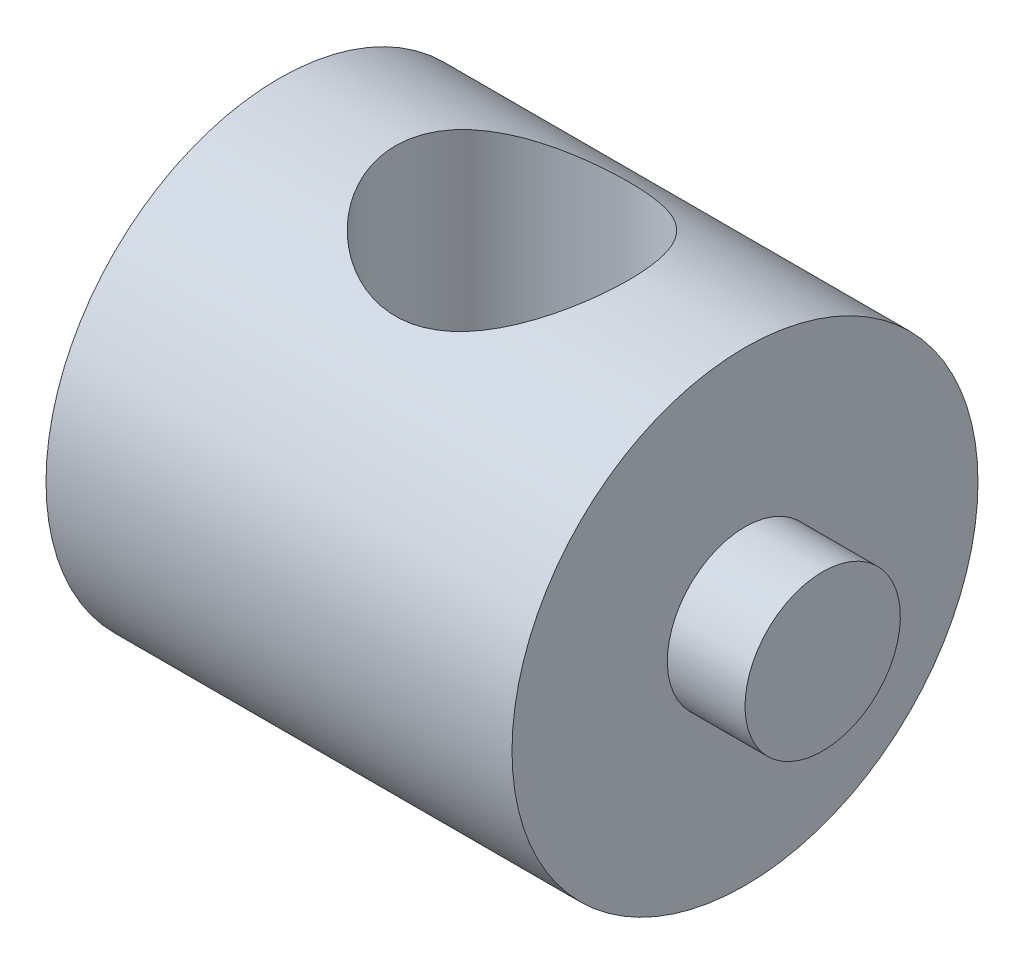
ISO-10303-21;
HEADER;
FILE_DESCRIPTION(('STEP AP214'),'2;1');
FILE_NAME('part.step','',(''),(''),'','','');
FILE_SCHEMA(('AUTOMOTIVE_DESIGN { 1 0 10303 214 1 1 1 1 }'));
ENDSEC;
DATA;
#1=APPLICATION_CONTEXT('core data for automotive mechanical design processes');
#2=APPLICATION_PROTOCOL_DEFINITION('international standard','automotive_design',2000,#1);
#3=PRODUCT_CONTEXT('',#1,'mechanical');
#4=PRODUCT('Part','Part','',(#3));
#5=PRODUCT_RELATED_PRODUCT_CATEGORY('part','',(#4));
#6=PRODUCT_DEFINITION_FORMATION('','',#4);
#7=PRODUCT_DEFINITION_CONTEXT('part definition',#1,'design');
#8=PRODUCT_DEFINITION('design','',#6,#7);
#9=PRODUCT_DEFINITION_SHAPE('','',#8);
#10=(LENGTH_UNIT() NAMED_UNIT(*) SI_UNIT(.MILLI.,.METRE.));
#11=(NAMED_UNIT(*) PLANE_ANGLE_UNIT() SI_UNIT($,.RADIAN.));
#12=(NAMED_UNIT(*) SI_UNIT($,.STERADIAN.) SOLID_ANGLE_UNIT());
#13=UNCERTAINTY_MEASURE_WITH_UNIT(LENGTH_MEASURE(1.E-05),#10,'distance_accuracy_value','');
#14=(GEOMETRIC_REPRESENTATION_CONTEXT(3) GLOBAL_UNCERTAINTY_ASSIGNED_CONTEXT((#13)) GLOBAL_UNIT_ASSIGNED_CONTEXT((#10,
#11,#12)) REPRESENTATION_CONTEXT('',''));
#15=CARTESIAN_POINT('',(0.,0.,0.));
#16=DIRECTION('',(0.,0.,1.));
#17=DIRECTION('',(1.,0.,0.));
#18=AXIS2_PLACEMENT_3D('',#15,#16,#17);
#19=CARTESIAN_POINT('',(-9.525,0.,0.));
#20=DIRECTION('',(1.,0.,0.));
#21=DIRECTION('',(0.,1.,0.));
#22=AXIS2_PLACEMENT_3D('',#19,#20,#21);
#23=PLANE('',#22);
#24=CARTESIAN_POINT('',(-9.525,0.,0.));
#25=DIRECTION('',(1.,0.,0.));
#26=DIRECTION('',(0.,1.,0.));
#27=AXIS2_PLACEMENT_3D('',#24,#25,#26);
#28=CIRCLE('',#27,9.52500000000001);
#29=CARTESIAN_POINT('',(-9.525,9.525,0.));
#30=VERTEX_POINT('',#29);
#31=EDGE_CURVE('E91',#30,#30,#28,.T.);
#32=ORIENTED_EDGE('',*,*,#31,.F.);
#33=EDGE_LOOP('',(#32));
#34=FACE_BOUND('',#33,.T.);
#35=CARTESIAN_POINT('',(-9.525,0.,0.));
#36=DIRECTION('',(1.,0.,0.));
#37=DIRECTION('',(0.,1.,0.));
#38=AXIS2_PLACEMENT_3D('',#35,#36,#37);
#39=CIRCLE('',#38,3.17500000000001);
#40=CARTESIAN_POINT('',(-9.525,3.175,0.));
#41=VERTEX_POINT('',#40);
#42=EDGE_CURVE('E56',#41,#41,#39,.T.);
#43=ORIENTED_EDGE('',*,*,#42,.T.);
#44=EDGE_LOOP('',(#43));
#45=FACE_BOUND('',#44,.T.);
#46=ADVANCED_FACE('F39',(#34,#45),#23,.F.);
#47=CARTESIAN_POINT('',(12.7,0.,0.));
#48=DIRECTION('',(1.,0.,0.));
#49=DIRECTION('',(0.,1.,0.));
#50=AXIS2_PLACEMENT_3D('',#47,#48,#49);
#51=CYLINDRICAL_SURFACE('',#50,3.17500000000001);
#52=CARTESIAN_POINT('',(-12.7,0.,0.));
#53=DIRECTION('',(1.,0.,0.));
#54=DIRECTION('',(0.,1.,0.));
#55=AXIS2_PLACEMENT_3D('',#52,#53,#54);
#56=CIRCLE('',#55,3.17500000000001);
#57=CARTESIAN_POINT('',(-12.7,3.175,0.));
#58=VERTEX_POINT('',#57);
#59=EDGE_CURVE('E61',#58,#58,#56,.T.);
#60=ORIENTED_EDGE('',*,*,#59,.T.);
#61=EDGE_LOOP('',(#60));
#62=FACE_BOUND('',#61,.T.);
#63=ORIENTED_EDGE('',*,*,#42,.F.);
#64=EDGE_LOOP('',(#63));
#65=FACE_BOUND('',#64,.T.);
#66=ADVANCED_FACE('F81',(#62,#65),#51,.T.);
#67=CARTESIAN_POINT('',(-12.7,0.,0.));
#68=DIRECTION('',(1.,0.,0.));
#69=DIRECTION('',(0.,1.,0.));
#70=AXIS2_PLACEMENT_3D('',#67,#68,#69);
#71=PLANE('',#70);
#72=ORIENTED_EDGE('',*,*,#59,.F.);
#73=EDGE_LOOP('',(#72));
#74=FACE_BOUND('',#73,.T.);
#75=ADVANCED_FACE('F86',(#74),#71,.F.);
#76=CARTESIAN_POINT('',(12.7,0.,0.));
#77=DIRECTION('',(1.,0.,0.));
#78=DIRECTION('',(0.,1.,0.));
#79=AXIS2_PLACEMENT_3D('',#76,#77,#78);
#80=PLANE('',#79);
#81=CARTESIAN_POINT('',(12.7,0.,0.));
#82=DIRECTION('',(1.,0.,0.));
#83=DIRECTION('',(0.,1.,0.));
#84=AXIS2_PLACEMENT_3D('',#81,#82,#83);
#85=CIRCLE('',#84,3.175);
#86=CARTESIAN_POINT('',(12.7,3.175,0.));
#87=VERTEX_POINT('',#86);
#88=EDGE_CURVE('E106',#87,#87,#85,.T.);
#89=ORIENTED_EDGE('',*,*,#88,.T.);
#90=EDGE_LOOP('',(#89));
#91=FACE_BOUND('',#90,.T.);
#92=ADVANCED_FACE('F114',(#91),#80,.T.);
#93=CARTESIAN_POINT('',(12.7,0.,0.));
#94=DIRECTION('',(1.,0.,0.));
#95=DIRECTION('',(0.,1.,0.));
#96=AXIS2_PLACEMENT_3D('',#93,#94,#95);
#97=CYLINDRICAL_SURFACE('',#96,3.175);
#98=ORIENTED_EDGE('',*,*,#88,.F.);
#99=EDGE_LOOP('',(#98));
#100=FACE_BOUND('',#99,.T.);
#101=CARTESIAN_POINT('',(9.525,0.,0.));
#102=DIRECTION('',(1.,0.,0.));
#103=DIRECTION('',(0.,1.,0.));
#104=AXIS2_PLACEMENT_3D('',#101,#102,#103);
#105=CIRCLE('',#104,3.175);
#106=CARTESIAN_POINT('',(9.525,3.175,0.));
#107=VERTEX_POINT('',#106);
#108=EDGE_CURVE('E100',#107,#107,#105,.T.);
#109=ORIENTED_EDGE('',*,*,#108,.T.);
#110=EDGE_LOOP('',(#109));
#111=FACE_BOUND('',#110,.T.);
#112=ADVANCED_FACE('F119',(#100,#111),#97,.T.);
#113=CARTESIAN_POINT('',(9.525,0.,0.));
#114=DIRECTION('',(1.,0.,0.));
#115=DIRECTION('',(0.,1.,0.));
#116=AXIS2_PLACEMENT_3D('',#113,#114,#115);
#117=PLANE('',#116);
#118=CARTESIAN_POINT('',(9.525,0.,0.));
#119=DIRECTION('',(1.,0.,0.));
#120=DIRECTION('',(0.,1.,0.));
#121=AXIS2_PLACEMENT_3D('',#118,#119,#120);
#122=CIRCLE('',#121,9.525);
#123=CARTESIAN_POINT('',(9.525,9.525,0.));
#124=VERTEX_POINT('',#123);
#125=EDGE_CURVE('E96',#124,#124,#122,.T.);
#126=ORIENTED_EDGE('',*,*,#125,.T.);
#127=EDGE_LOOP('',(#126));
#128=FACE_BOUND('',#127,.T.);
#129=ORIENTED_EDGE('',*,*,#108,.F.);
#130=EDGE_LOOP('',(#129));
#131=FACE_BOUND('',#130,.T.);
#132=ADVANCED_FACE('F78',(#128,#131),#117,.T.);
#133=CARTESIAN_POINT('',(12.7,0.,0.));
#134=DIRECTION('',(1.,0.,0.));
#135=DIRECTION('',(0.,1.,0.));
#136=AXIS2_PLACEMENT_3D('',#133,#134,#135);
#137=CYLINDRICAL_SURFACE('',#136,9.525);
#138=CARTESIAN_POINT('',(4.7625,-9.52500000000001,0.));
#139=CARTESIAN_POINT('',(4.76249958831423,-9.52499962063721,-0.125243167799989));
#140=CARTESIAN_POINT('',(4.75755388154092,-9.52252400598023,-0.250495089131835));
#141=CARTESIAN_POINT('',(4.73782749335829,-9.51268396387997,-0.500076393496525));
#142=CARTESIAN_POINT('',(4.72304253341983,-9.50531740964972,-0.624405351393145));
#143=CARTESIAN_POINT('',(4.68378465754782,-9.48587193787975,-0.871331001268147));
#144=CARTESIAN_POINT('',(4.65929792572799,-9.47378630044848,-0.993924963523297));
#145=CARTESIAN_POINT('',(4.60090773438337,-9.44520637539278,-1.23637011508467));
#146=CARTESIAN_POINT('',(4.56700042522137,-9.42871028557932,-1.35622016139572));
#147=CARTESIAN_POINT('',(4.49029599546492,-9.3917969722246,-1.59183120722171));
#148=CARTESIAN_POINT('',(4.44753811225714,-9.37139708461429,-1.70760770137533));
#149=CARTESIAN_POINT('',(4.35345002008972,-9.3271126718355,-1.93495086483045));
#150=CARTESIAN_POINT('',(4.30211658479887,-9.30322683559748,-2.04651593025));
#151=CARTESIAN_POINT('',(4.13594585342937,-9.22716144615755,-2.37384489745524));
#152=CARTESIAN_POINT('',(4.00885268845467,-9.1705315085718,-2.58250225923313));
#153=CARTESIAN_POINT('',(3.7170309696508,-9.04666081910159,-2.9885453858336));
#154=CARTESIAN_POINT('',(3.55049071765087,-8.9789854011414,-3.18448556312959));
#155=CARTESIAN_POINT('',(3.18840889326789,-8.84205954293002,-3.5469969745544));
#156=CARTESIAN_POINT('',(2.99284542792684,-8.77280794740667,-3.71354582861883));
#157=CARTESIAN_POINT('',(2.5598674226152,-8.63435408613187,-4.02553537328567));
#158=CARTESIAN_POINT('',(2.32038345074362,-8.56557212539104,-4.16833749963762));
#159=CARTESIAN_POINT('',(1.94317806162735,-8.47379640254793,-4.35029005345508));
#160=CARTESIAN_POINT('',(1.81439982504697,-8.44509626519091,-4.40557901885787));
#161=CARTESIAN_POINT('',(1.55162131087768,-8.39256904955605,-4.50483773649694));
#162=CARTESIAN_POINT('',(1.4176241795386,-8.36873908777995,-4.54881419057647));
#163=CARTESIAN_POINT('',(1.15348439070287,-8.32818911059646,-4.62261399582858));
#164=CARTESIAN_POINT('',(1.0235845780924,-8.31113119648639,-4.65312214328153));
#165=CARTESIAN_POINT('',(0.761118312858169,-8.28290506375684,-4.7031837839128));
#166=CARTESIAN_POINT('',(0.628553313822608,-8.27173372047613,-4.72274308921002));
#167=CARTESIAN_POINT('',(0.361942745544749,-8.25575723957705,-4.75061653464239));
#168=CARTESIAN_POINT('',(0.227898117086415,-8.25094826797976,-4.75893744712047));
#169=CARTESIAN_POINT('',(-0.0404818193190381,-8.24790017307781,-4.76421854927812));
#170=CARTESIAN_POINT('',(-0.174817098310512,-8.24966042295242,-4.76117982286953));
#171=CARTESIAN_POINT('',(-0.426439463053399,-8.25906842780931,-4.74483797280581));
#172=CARTESIAN_POINT('',(-0.543838732731231,-8.26598467895691,-4.73280973448218));
#173=CARTESIAN_POINT('',(-0.77706332574491,-8.28459407928507,-4.7001560114978));
#174=CARTESIAN_POINT('',(-0.892888142929271,-8.29628872876443,-4.67952782662532));
#175=CARTESIAN_POINT('',(-1.23679640510272,-8.33800444414718,-4.60506661909892));
#176=CARTESIAN_POINT('',(-1.46148677858525,-8.374664603912,-4.5386452957775));
#177=CARTESIAN_POINT('',(-1.90136422745735,-8.46236620531705,-4.37297035741612));
#178=CARTESIAN_POINT('',(-2.11620803502557,-8.51372273880605,-4.27298801966147));
#179=CARTESIAN_POINT('',(-2.52713750391294,-8.62505005190895,-4.04355977442936));
#180=CARTESIAN_POINT('',(-2.72321468317278,-8.68502469635285,-3.91410063264098));
#181=CARTESIAN_POINT('',(-3.11715493103464,-8.81601207894061,-3.61029947812718));
#182=CARTESIAN_POINT('',(-3.31209202014425,-8.88746017331489,-3.43234782914613));
#183=CARTESIAN_POINT('',(-3.67064878147008,-9.02721381532402,-3.04584295330871));
#184=CARTESIAN_POINT('',(-3.83425348656057,-9.09551784930111,-2.83727518509305));
#185=CARTESIAN_POINT('',(-4.05616532663717,-9.19195370403877,-2.49965137796343));
#186=CARTESIAN_POINT('',(-4.12751797031745,-9.22372787983904,-2.38002127368373));
#187=CARTESIAN_POINT('',(-4.25977821368204,-9.28366556941998,-2.13427687141611));
#188=CARTESIAN_POINT('',(-4.32069021646027,-9.31183060399967,-2.00816533613018));
#189=CARTESIAN_POINT('',(-4.43140995548221,-9.3637184492558,-1.75034069526616));
#190=CARTESIAN_POINT('',(-4.48122216181515,-9.38744304755807,-1.61862987016266));
#191=CARTESIAN_POINT('',(-4.56916623782169,-9.42974072645534,-1.35056106639509));
#192=CARTESIAN_POINT('',(-4.60729945117316,-9.4483143996453,-1.21420362433566));
#193=CARTESIAN_POINT('',(-4.66871072091767,-9.47841891468133,-0.949450109300048));
#194=CARTESIAN_POINT('',(-4.69295751387122,-9.49040564136937,-0.821329961906902));
#195=CARTESIAN_POINT('',(-4.73088465881512,-9.50921741531495,-0.563164063018348));
#196=CARTESIAN_POINT('',(-4.74456594486943,-9.51604291885924,-0.433118482780759));
#197=CARTESIAN_POINT('',(-4.76117903695803,-9.52433687415141,-0.172222200636558));
#198=CARTESIAN_POINT('',(-4.76411495832146,-9.52580737679104,-0.0413718261918279));
#199=CARTESIAN_POINT('',(-4.75920856581017,-9.52335444060486,0.220072847166309));
#200=CARTESIAN_POINT('',(-4.75136672893597,-9.5194312404928,0.350667157156418));
#201=CARTESIAN_POINT('',(-4.72603956317407,-9.50681651861089,0.600383632816324));
#202=CARTESIAN_POINT('',(-4.70935204534436,-9.49851975936574,0.71960779805965));
#203=CARTESIAN_POINT('',(-4.66708381392194,-9.47763434053447,0.956123558476324));
#204=CARTESIAN_POINT('',(-4.64150028350313,-9.46504432155854,1.07341452918894));
#205=CARTESIAN_POINT('',(-4.58171294409776,-9.43586934009924,1.30523272581463));
#206=CARTESIAN_POINT('',(-4.54751177299423,-9.41928560017322,1.41976078572846));
#207=CARTESIAN_POINT('',(-4.47081767633952,-9.38249998161801,1.64542419391326));
#208=CARTESIAN_POINT('',(-4.42832157448654,-9.36229671724176,1.75655822362735));
#209=CARTESIAN_POINT('',(-4.2862997139752,-9.29566539786795,2.09007412634844));
#210=CARTESIAN_POINT('',(-4.17391144344975,-9.24405921515466,2.3061103310862));
#211=CARTESIAN_POINT('',(-3.91901153595821,-9.13180205397676,2.7168591855057));
#212=CARTESIAN_POINT('',(-3.77648706665232,-9.07114722574503,2.91156269769227));
#213=CARTESIAN_POINT('',(-3.44920510528762,-8.93960783885979,3.29452731372962));
#214=CARTESIAN_POINT('',(-3.26167471385581,-8.868303631423,3.48027815582499));
#215=CARTESIAN_POINT('',(-2.85781381337991,-8.72786114875584,3.81886460963264));
#216=CARTESIAN_POINT('',(-2.64146354739159,-8.65872439991559,3.97167745144758));
#217=CARTESIAN_POINT('',(-2.29315273566664,-8.56092960704944,4.17638881115548));
#218=CARTESIAN_POINT('',(-2.16993704199734,-8.52864647367418,4.24173741059432));
#219=CARTESIAN_POINT('',(-1.91748336900804,-8.46793790675363,4.36167001930206));
#220=CARTESIAN_POINT('',(-1.78824815034194,-8.43951072775552,4.41625890421415));
#221=CARTESIAN_POINT('',(-1.52468862385271,-8.38762286815761,4.51403084118841));
#222=CARTESIAN_POINT('',(-1.39036857839809,-8.3641581318998,4.55722321448887));
#223=CARTESIAN_POINT('',(-1.11757678170936,-8.32316235190996,4.63167416627274));
#224=CARTESIAN_POINT('',(-0.979105676886767,-8.30563038948563,4.66293459251873));
#225=CARTESIAN_POINT('',(-0.712693855087649,-8.27866590076996,4.71062527640278));
#226=CARTESIAN_POINT('',(-0.585017991328247,-8.26861751501086,4.72819092555356));
#227=CARTESIAN_POINT('',(-0.328340803473246,-8.25443000373948,4.75291664228841));
#228=CARTESIAN_POINT('',(-0.199339619676061,-8.25029025909994,4.76007780009145));
#229=CARTESIAN_POINT('',(0.0588234710669067,-8.24809207938037,4.7638856717754));
#230=CARTESIAN_POINT('',(0.187985305559261,-8.25003150672728,4.76053608147038));
#231=CARTESIAN_POINT('',(0.445375243945348,-8.25990551900991,4.74338307929259));
#232=CARTESIAN_POINT('',(0.573603385847067,-8.2678398585166,4.72958009537705));
#233=CARTESIAN_POINT('',(0.815873592556456,-8.28834856879424,4.69353669139923));
#234=CARTESIAN_POINT('',(0.930099638041787,-8.30040666790683,4.67222934629288));
#235=CARTESIAN_POINT('',(1.15620278401551,-8.32877048505192,4.62147643847892));
#236=CARTESIAN_POINT('',(1.26807914659067,-8.34507751652015,4.59202835912458));
#237=CARTESIAN_POINT('',(1.59916855214504,-8.3996615585496,4.49189766535446));
#238=CARTESIAN_POINT('',(1.81399443047416,-8.44361545117001,4.40940547807408));
#239=CARTESIAN_POINT('',(2.24138522605267,-8.54528603634262,4.20916574352957));
#240=CARTESIAN_POINT('',(2.45282854237986,-8.60372898549138,4.08942191082135));
#241=CARTESIAN_POINT('',(2.85403681438992,-8.72658246261697,3.82024338512734));
#242=CARTESIAN_POINT('',(3.04379041048057,-8.79099608593485,3.67079324521365));
#243=CARTESIAN_POINT('',(3.42014923519336,-8.92789150982252,3.32520368388597));
#244=CARTESIAN_POINT('',(3.60357040787616,-9.00040265167881,3.12559766366325));
#245=CARTESIAN_POINT('',(3.93509603617707,-9.13818513010387,2.69626914168462));
#246=CARTESIAN_POINT('',(4.08318145555075,-9.20345255422176,2.4665305095516));
#247=CARTESIAN_POINT('',(4.2754204698368,-9.29086610240478,2.10268072495819));
#248=CARTESIAN_POINT('',(4.33470089313457,-9.3183476000623,1.97763300723183));
#249=CARTESIAN_POINT('',(4.44239918870466,-9.36893044835914,1.72211552262134));
#250=CARTESIAN_POINT('',(4.49082239743041,-9.39203394996841,1.59164845695407));
#251=CARTESIAN_POINT('',(4.57613903004475,-9.43312646132605,1.32654199767926));
#252=CARTESIAN_POINT('',(4.6130576010708,-9.45112661821365,1.19191242135595));
#253=CARTESIAN_POINT('',(4.67500106044581,-9.48151473751691,0.919388438520269));
#254=CARTESIAN_POINT('',(4.700033214082,-9.49390612793916,0.781496080561076));
#255=CARTESIAN_POINT('',(4.73342449172891,-9.5104875945448,0.536297175823772));
#256=CARTESIAN_POINT('',(4.74431844539165,-9.51592021375587,0.42941158376785));
#257=CARTESIAN_POINT('',(4.75885647628327,-9.5231766291168,0.215019489362879));
#258=CARTESIAN_POINT('',(4.76250035340499,-9.52500032565786,0.107512969957934));
#259=CARTESIAN_POINT('',(4.7625,-9.52500000000001,0.));
#260=B_SPLINE_CURVE_WITH_KNOTS('',3,(#138,#139,#140,#141,#142,#143,#144,#145,#146,#147,#148,
#149,#150,#151,#152,#153,#154,#155,#156,#157,#158,#159,#160,#161,#162,#163,#164,#165,#166,#167,
#168,#169,#170,#171,#172,#173,#174,#175,#176,#177,#178,#179,#180,#181,#182,#183,#184,#185,#186,
#187,#188,#189,#190,#191,#192,#193,#194,#195,#196,#197,#198,#199,#200,#201,#202,#203,#204,#205,
#206,#207,#208,#209,#210,#211,#212,#213,#214,#215,#216,#217,#218,#219,#220,#221,#222,#223,#224,
#225,#226,#227,#228,#229,#230,#231,#232,#233,#234,#235,#236,#237,#238,#239,#240,#241,#242,#243,
#244,#245,#246,#247,#248,#249,#250,#251,#252,#253,#254,#255,#256,#257,#258,#259),.UNSPECIFIED.,
.T.,.F.,(4,2,2,2,2,2,2,2,2,2,2,2,2,2,2,2,2,2,2,2,2,2,2,2,2,2,2,2,2,2,2,2,2,2,2,2,2,2,2,2,2,2,2,
2,2,2,2,2,2,2,2,2,2,2,2,2,2,2,2,2,4),(0.,0.37562341815402,0.75141028029602,1.12773421934005,
1.50421216665562,1.87905550525341,2.25404018794787,3.00318908218551,3.79765979831069,
4.59273287924314,5.44946389368039,5.8781190538996,6.30651967909288,6.70950847539314,
7.11228314445236,7.51481498990845,7.91730842763879,8.27152461989833,8.62585211283934,
9.33399259637595,10.0586277474397,10.7835888844336,11.6004728904415,12.4177461446779,
12.8458801890468,13.2738332313566,13.701613616489,14.1293447666274,14.521651524315,
14.913923595397,15.3060454158579,15.698149882404,16.0597456619957,16.4214560413944,
16.7830558344937,17.144794364286,17.8882174899416,18.6319578135026,19.4487341785404,
20.2660733794108,20.6950689367829,21.1238696504806,21.5523185520335,21.9807010777177,
22.3679690015927,22.7551963432537,23.1422875423821,23.5293628950278,23.8794231642634,
24.2295917732494,24.9294696536929,25.6763690993088,26.423657944613,27.2617475314397,
28.1002876036314,28.5230685284024,28.9456411934233,29.3672836019069,29.7886679587935,
30.1111069020891,30.4335547448008),.UNSPECIFIED.);
#261=CARTESIAN_POINT('',(4.7625,-9.52500000000001,0.));
#262=VERTEX_POINT('',#261);
#263=EDGE_CURVE('E10',#262,#262,#260,.T.);
#264=ORIENTED_EDGE('',*,*,#263,.T.);
#265=EDGE_LOOP('',(#264));
#266=FACE_BOUND('',#265,.T.);
#267=CARTESIAN_POINT('',(-4.7625,9.525,0.));
#268=CARTESIAN_POINT('',(-4.76249958831423,9.5249996206372,-0.125243167799989));
#269=CARTESIAN_POINT('',(-4.75755388154092,9.52252400598022,-0.250495089131835));
#270=CARTESIAN_POINT('',(-4.73782749335829,9.51268396387997,-0.500076393496526));
#271=CARTESIAN_POINT('',(-4.72304253341983,9.50531740964971,-0.624405351393146));
#272=CARTESIAN_POINT('',(-4.68378465754782,9.48587193787975,-0.871331001268148));
#273=CARTESIAN_POINT('',(-4.65929792572799,9.47378630044847,-0.993924963523298));
#274=CARTESIAN_POINT('',(-4.60090773438337,9.44520637539277,-1.23637011508467));
#275=CARTESIAN_POINT('',(-4.56700042522137,9.42871028557932,-1.35622016139572));
#276=CARTESIAN_POINT('',(-4.49029599546492,9.39179697222459,-1.59183120722171));
#277=CARTESIAN_POINT('',(-4.44753811225714,9.37139708461428,-1.70760770137533));
#278=CARTESIAN_POINT('',(-4.35345002008972,9.3271126718355,-1.93495086483045));
#279=CARTESIAN_POINT('',(-4.30211658479887,9.30322683559748,-2.04651593025));
#280=CARTESIAN_POINT('',(-4.13594585342936,9.22716144615755,-2.37384489745524));
#281=CARTESIAN_POINT('',(-4.00885268845467,9.17053150857179,-2.58250225923313));
#282=CARTESIAN_POINT('',(-3.7170309696508,9.04666081910159,-2.9885453858336));
#283=CARTESIAN_POINT('',(-3.55049071765087,8.97898540114139,-3.18448556312959));
#284=CARTESIAN_POINT('',(-3.18840889326789,8.84205954293001,-3.5469969745544));
#285=CARTESIAN_POINT('',(-2.99284542792684,8.77280794740667,-3.71354582861883));
#286=CARTESIAN_POINT('',(-2.5598674226152,8.63435408613186,-4.02553537328567));
#287=CARTESIAN_POINT('',(-2.32038345074362,8.56557212539103,-4.16833749963762));
#288=CARTESIAN_POINT('',(-1.94317806162735,8.47379640254792,-4.35029005345507));
#289=CARTESIAN_POINT('',(-1.81439982504697,8.4450962651909,-4.40557901885787));
#290=CARTESIAN_POINT('',(-1.55162131087768,8.39256904955604,-4.50483773649694));
#291=CARTESIAN_POINT('',(-1.4176241795386,8.36873908777994,-4.54881419057647));
#292=CARTESIAN_POINT('',(-1.15348439070287,8.32818911059645,-4.62261399582858));
#293=CARTESIAN_POINT('',(-1.0235845780924,8.31113119648638,-4.65312214328153));
#294=CARTESIAN_POINT('',(-0.761118312858171,8.28290506375683,-4.7031837839128));
#295=CARTESIAN_POINT('',(-0.62855331382261,8.27173372047612,-4.72274308921002));
#296=CARTESIAN_POINT('',(-0.361942745544751,8.25575723957705,-4.75061653464239));
#297=CARTESIAN_POINT('',(-0.227898117086418,8.25094826797976,-4.75893744712047));
#298=CARTESIAN_POINT('',(0.0404818193190358,8.24790017307781,-4.76421854927812));
#299=CARTESIAN_POINT('',(0.17481709831051,8.24966042295241,-4.76117982286953));
#300=CARTESIAN_POINT('',(0.426439463053396,8.25906842780931,-4.74483797280581));
#301=CARTESIAN_POINT('',(0.543838732731228,8.2659846789569,-4.73280973448218));
#302=CARTESIAN_POINT('',(0.777063325744906,8.28459407928506,-4.7001560114978));
#303=CARTESIAN_POINT('',(0.892888142929268,8.29628872876442,-4.67952782662532));
#304=CARTESIAN_POINT('',(1.23679640510272,8.33800444414718,-4.60506661909892));
#305=CARTESIAN_POINT('',(1.46148677858524,8.37466460391199,-4.5386452957775));
#306=CARTESIAN_POINT('',(1.90136422745735,8.46236620531704,-4.37297035741612));
#307=CARTESIAN_POINT('',(2.11620803502557,8.51372273880604,-4.27298801966147));
#308=CARTESIAN_POINT('',(2.52713750391294,8.62505005190895,-4.04355977442936));
#309=CARTESIAN_POINT('',(2.72321468317278,8.68502469635285,-3.91410063264099));
#310=CARTESIAN_POINT('',(3.11715493103464,8.8160120789406,-3.61029947812719));
#311=CARTESIAN_POINT('',(3.31209202014425,8.88746017331489,-3.43234782914613));
#312=CARTESIAN_POINT('',(3.67064878147008,9.02721381532401,-3.04584295330871));
#313=CARTESIAN_POINT('',(3.83425348656057,9.0955178493011,-2.83727518509305));
#314=CARTESIAN_POINT('',(4.05616532663717,9.19195370403877,-2.49965137796343));
#315=CARTESIAN_POINT('',(4.12751797031745,9.22372787983903,-2.38002127368373));
#316=CARTESIAN_POINT('',(4.25977821368204,9.28366556941998,-2.13427687141612));
#317=CARTESIAN_POINT('',(4.32069021646027,9.31183060399966,-2.00816533613018));
#318=CARTESIAN_POINT('',(4.43140995548221,9.36371844925579,-1.75034069526616));
#319=CARTESIAN_POINT('',(4.48122216181515,9.38744304755806,-1.61862987016266));
#320=CARTESIAN_POINT('',(4.56916623782169,9.42974072645533,-1.3505610663951));
#321=CARTESIAN_POINT('',(4.60729945117316,9.4483143996453,-1.21420362433566));
#322=CARTESIAN_POINT('',(4.66871072091767,9.47841891468132,-0.949450109300049));
#323=CARTESIAN_POINT('',(4.69295751387122,9.49040564136936,-0.821329961906903));
#324=CARTESIAN_POINT('',(4.73088465881512,9.50921741531494,-0.563164063018348));
#325=CARTESIAN_POINT('',(4.74456594486943,9.51604291885924,-0.43311848278076));
#326=CARTESIAN_POINT('',(4.76117903695803,9.52433687415141,-0.172222200636558));
#327=CARTESIAN_POINT('',(4.76411495832146,9.52580737679104,-0.0413718261918288));
#328=CARTESIAN_POINT('',(4.75920856581017,9.52335444060485,0.220072847166307));
#329=CARTESIAN_POINT('',(4.75136672893597,9.51943124049279,0.350667157156417));
#330=CARTESIAN_POINT('',(4.72603956317407,9.50681651861088,0.600383632816322));
#331=CARTESIAN_POINT('',(4.70935204534436,9.49851975936574,0.719607798059648));
#332=CARTESIAN_POINT('',(4.66708381392194,9.47763434053446,0.956123558476322));
#333=CARTESIAN_POINT('',(4.64150028350313,9.46504432155854,1.07341452918894));
#334=CARTESIAN_POINT('',(4.58171294409776,9.43586934009923,1.30523272581462));
#335=CARTESIAN_POINT('',(4.54751177299423,9.41928560017321,1.41976078572846));
#336=CARTESIAN_POINT('',(4.47081767633952,9.382499981618,1.64542419391326));
#337=CARTESIAN_POINT('',(4.42832157448654,9.36229671724176,1.75655822362735));
#338=CARTESIAN_POINT('',(4.2862997139752,9.29566539786795,2.09007412634844));
#339=CARTESIAN_POINT('',(4.17391144344975,9.24405921515466,2.3061103310862));
#340=CARTESIAN_POINT('',(3.91901153595821,9.13180205397676,2.7168591855057));
#341=CARTESIAN_POINT('',(3.77648706665232,9.07114722574502,2.91156269769227));
#342=CARTESIAN_POINT('',(3.44920510528762,8.93960783885979,3.29452731372962));
#343=CARTESIAN_POINT('',(3.26167471385581,8.868303631423,3.48027815582498));
#344=CARTESIAN_POINT('',(2.85781381337991,8.72786114875584,3.81886460963264));
#345=CARTESIAN_POINT('',(2.64146354739159,8.65872439991558,3.97167745144758));
#346=CARTESIAN_POINT('',(2.29315273566664,8.56092960704944,4.17638881115548));
#347=CARTESIAN_POINT('',(2.16993704199735,8.52864647367417,4.24173741059432));
#348=CARTESIAN_POINT('',(1.91748336900804,8.46793790675362,4.36167001930206));
#349=CARTESIAN_POINT('',(1.78824815034194,8.43951072775551,4.41625890421415));
#350=CARTESIAN_POINT('',(1.52468862385272,8.3876228681576,4.51403084118841));
#351=CARTESIAN_POINT('',(1.39036857839809,8.36415813189979,4.55722321448887));
#352=CARTESIAN_POINT('',(1.11757678170937,8.32316235190995,4.63167416627274));
#353=CARTESIAN_POINT('',(0.979105676886771,8.30563038948562,4.66293459251873));
#354=CARTESIAN_POINT('',(0.712693855087652,8.27866590076996,4.71062527640278));
#355=CARTESIAN_POINT('',(0.58501799132825,8.26861751501085,4.72819092555356));
#356=CARTESIAN_POINT('',(0.328340803473248,8.25443000373948,4.75291664228841));
#357=CARTESIAN_POINT('',(0.199339619676064,8.25029025909993,4.76007780009145));
#358=CARTESIAN_POINT('',(-0.058823471066903,8.24809207938036,4.7638856717754));
#359=CARTESIAN_POINT('',(-0.187985305559256,8.25003150672727,4.76053608147038));
#360=CARTESIAN_POINT('',(-0.445375243945344,8.2599055190099,4.74338307929259));
#361=CARTESIAN_POINT('',(-0.573603385847064,8.26783985851659,4.72958009537705));
#362=CARTESIAN_POINT('',(-0.815873592556455,8.28834856879423,4.69353669139923));
#363=CARTESIAN_POINT('',(-0.930099638041787,8.30040666790683,4.67222934629288));
#364=CARTESIAN_POINT('',(-1.15620278401552,8.32877048505191,4.62147643847892));
#365=CARTESIAN_POINT('',(-1.26807914659067,8.34507751652014,4.59202835912458));
#366=CARTESIAN_POINT('',(-1.59916855214504,8.3996615585496,4.49189766535446));
#367=CARTESIAN_POINT('',(-1.81399443047416,8.44361545117001,4.40940547807408));
#368=CARTESIAN_POINT('',(-2.24138522605267,8.54528603634261,4.20916574352957));
#369=CARTESIAN_POINT('',(-2.45282854237986,8.60372898549137,4.08942191082135));
#370=CARTESIAN_POINT('',(-2.85403681438992,8.72658246261697,3.82024338512734));
#371=CARTESIAN_POINT('',(-3.04379041048057,8.79099608593484,3.67079324521365));
#372=CARTESIAN_POINT('',(-3.42014923519336,8.92789150982252,3.32520368388597));
#373=CARTESIAN_POINT('',(-3.60357040787616,9.00040265167881,3.12559766366325));
#374=CARTESIAN_POINT('',(-3.93509603617707,9.13818513010387,2.69626914168463));
#375=CARTESIAN_POINT('',(-4.08318145555075,9.20345255422175,2.4665305095516));
#376=CARTESIAN_POINT('',(-4.2754204698368,9.29086610240478,2.10268072495819));
#377=CARTESIAN_POINT('',(-4.33470089313457,9.31834760006229,1.97763300723183));
#378=CARTESIAN_POINT('',(-4.44239918870466,9.36893044835914,1.72211552262134));
#379=CARTESIAN_POINT('',(-4.49082239743041,9.39203394996841,1.59164845695407));
#380=CARTESIAN_POINT('',(-4.57613903004474,9.43312646132604,1.32654199767926));
#381=CARTESIAN_POINT('',(-4.6130576010708,9.45112661821364,1.19191242135595));
#382=CARTESIAN_POINT('',(-4.67500106044581,9.48151473751691,0.91938843852027));
#383=CARTESIAN_POINT('',(-4.700033214082,9.49390612793915,0.781496080561077));
#384=CARTESIAN_POINT('',(-4.73342449172891,9.51048759454479,0.536297175823774));
#385=CARTESIAN_POINT('',(-4.74431844539165,9.51592021375586,0.429411583767851));
#386=CARTESIAN_POINT('',(-4.75885647628327,9.52317662911679,0.215019489362879));
#387=CARTESIAN_POINT('',(-4.76250035340499,9.52500032565785,0.107512969957934));
#388=CARTESIAN_POINT('',(-4.7625,9.525,0.));
#389=B_SPLINE_CURVE_WITH_KNOTS('',3,(#267,#268,#269,#270,#271,#272,#273,#274,#275,#276,#277,
#278,#279,#280,#281,#282,#283,#284,#285,#286,#287,#288,#289,#290,#291,#292,#293,#294,#295,#296,
#297,#298,#299,#300,#301,#302,#303,#304,#305,#306,#307,#308,#309,#310,#311,#312,#313,#314,#315,
#316,#317,#318,#319,#320,#321,#322,#323,#324,#325,#326,#327,#328,#329,#330,#331,#332,#333,#334,
#335,#336,#337,#338,#339,#340,#341,#342,#343,#344,#345,#346,#347,#348,#349,#350,#351,#352,#353,
#354,#355,#356,#357,#358,#359,#360,#361,#362,#363,#364,#365,#366,#367,#368,#369,#370,#371,#372,
#373,#374,#375,#376,#377,#378,#379,#380,#381,#382,#383,#384,#385,#386,#387,#388),.UNSPECIFIED.,
.T.,.F.,(4,2,2,2,2,2,2,2,2,2,2,2,2,2,2,2,2,2,2,2,2,2,2,2,2,2,2,2,2,2,2,2,2,2,2,2,2,2,2,2,2,2,2,
2,2,2,2,2,2,2,2,2,2,2,2,2,2,2,2,2,4),(0.,0.37562341815402,0.751410280296021,1.12773421934005,
1.50421216665562,1.87905550525341,2.25404018794787,3.00318908218551,3.79765979831069,
4.59273287924314,5.44946389368039,5.8781190538996,6.30651967909288,6.70950847539314,
7.11228314445236,7.51481498990844,7.91730842763879,8.27152461989833,8.62585211283933,
9.33399259637594,10.0586277474397,10.7835888844336,11.6004728904415,12.4177461446779,
12.8458801890468,13.2738332313566,13.701613616489,14.1293447666274,14.521651524315,
14.913923595397,15.3060454158579,15.698149882404,16.0597456619957,16.4214560413944,
16.7830558344937,17.144794364286,17.8882174899416,18.6319578135026,19.4487341785404,
20.2660733794108,20.6950689367829,21.1238696504806,21.5523185520335,21.9807010777177,
22.3679690015927,22.7551963432537,23.1422875423821,23.5293628950278,23.8794231642634,
24.2295917732494,24.9294696536929,25.6763690993088,26.423657944613,27.2617475314397,
28.1002876036314,28.5230685284024,28.9456411934233,29.3672836019069,29.7886679587935,
30.1111069020891,30.4335547448008),.UNSPECIFIED.);
#390=CARTESIAN_POINT('',(-4.7625,9.525,0.));
#391=VERTEX_POINT('',#390);
#392=EDGE_CURVE('E51',#391,#391,#389,.T.);
#393=ORIENTED_EDGE('',*,*,#392,.T.);
#394=EDGE_LOOP('',(#393));
#395=FACE_BOUND('',#394,.T.);
#396=ORIENTED_EDGE('',*,*,#125,.F.);
#397=EDGE_LOOP('',(#396));
#398=FACE_BOUND('',#397,.T.);
#399=ORIENTED_EDGE('',*,*,#31,.T.);
#400=EDGE_LOOP('',(#399));
#401=FACE_BOUND('',#400,.T.);
#402=ADVANCED_FACE('F67',(#266,#395,#398,#401),#137,.T.);
#403=CARTESIAN_POINT('',(0.,-9.52500000000001,0.));
#404=DIRECTION('',(0.,1.,0.));
#405=DIRECTION('',(0.,0.,1.));
#406=AXIS2_PLACEMENT_3D('',#403,#404,#405);
#407=CYLINDRICAL_SURFACE('',#406,4.7625);
#408=ORIENTED_EDGE('',*,*,#263,.F.);
#409=EDGE_LOOP('',(#408));
#410=FACE_BOUND('',#409,.T.);
#411=ORIENTED_EDGE('',*,*,#392,.F.);
#412=EDGE_LOOP('',(#411));
#413=FACE_BOUND('',#412,.T.);
#414=ADVANCED_FACE('F70',(#410,#413),#407,.F.);
#415=CLOSED_SHELL('',(#46,#66,#75,#92,#112,#132,#402,#414));
#416=MANIFOLD_SOLID_BREP('B2',#415);
#417=ADVANCED_BREP_SHAPE_REPRESENTATION('',(#18,#416),#14);
#418=SHAPE_DEFINITION_REPRESENTATION(#9,#417);
ENDSEC;
END-ISO-10303-21;
